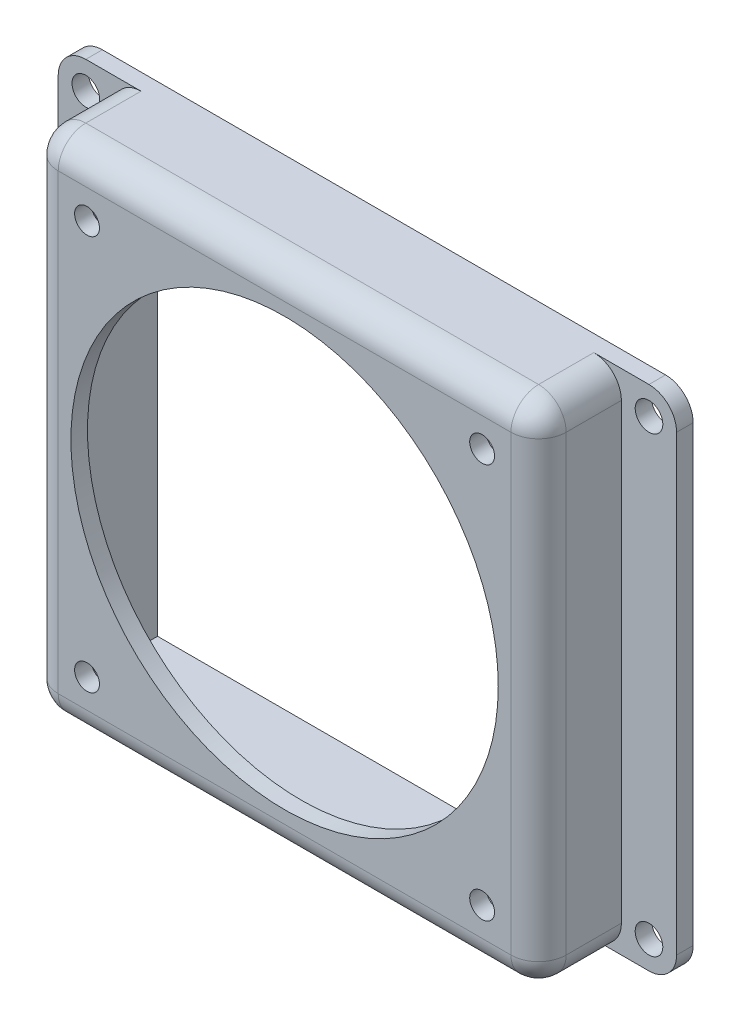
ISO-10303-21;
HEADER;
FILE_DESCRIPTION(('STEP AP214'),'2;1');
FILE_NAME('part.step','',(''),(''),'','','');
FILE_SCHEMA(('AUTOMOTIVE_DESIGN { 1 0 10303 214 1 1 1 1 }'));
ENDSEC;
DATA;
#1=APPLICATION_CONTEXT('core data for automotive mechanical design processes');
#2=APPLICATION_PROTOCOL_DEFINITION('international standard','automotive_design',2000,#1);
#3=PRODUCT_CONTEXT('',#1,'mechanical');
#4=PRODUCT('Part','Part','',(#3));
#5=PRODUCT_RELATED_PRODUCT_CATEGORY('part','',(#4));
#6=PRODUCT_DEFINITION_FORMATION('','',#4);
#7=PRODUCT_DEFINITION_CONTEXT('part definition',#1,'design');
#8=PRODUCT_DEFINITION('design','',#6,#7);
#9=PRODUCT_DEFINITION_SHAPE('','',#8);
#10=(LENGTH_UNIT() NAMED_UNIT(*) SI_UNIT(.MILLI.,.METRE.));
#11=(NAMED_UNIT(*) PLANE_ANGLE_UNIT() SI_UNIT($,.RADIAN.));
#12=(NAMED_UNIT(*) SI_UNIT($,.STERADIAN.) SOLID_ANGLE_UNIT());
#13=UNCERTAINTY_MEASURE_WITH_UNIT(LENGTH_MEASURE(1.E-05),#10,'distance_accuracy_value','');
#14=(GEOMETRIC_REPRESENTATION_CONTEXT(3) GLOBAL_UNCERTAINTY_ASSIGNED_CONTEXT((#13)) GLOBAL_UNIT_ASSIGNED_CONTEXT((#10,
#11,#12)) REPRESENTATION_CONTEXT('',''));
#15=CARTESIAN_POINT('',(0.,0.,0.));
#16=DIRECTION('',(0.,0.,1.));
#17=DIRECTION('',(1.,0.,0.));
#18=AXIS2_PLACEMENT_3D('',#15,#16,#17);
#19=CARTESIAN_POINT('',(0.,0.,3.));
#20=DIRECTION('',(0.,0.,-1.));
#21=DIRECTION('',(-1.,0.,0.));
#22=AXIS2_PLACEMENT_3D('',#19,#20,#21);
#23=PLANE('',#22);
#24=DIRECTION('',(-1.,0.,0.));
#25=VECTOR('',#24,1.);
#26=CARTESIAN_POINT('',(0.,41.,3.));
#27=LINE('',#26,#25);
#28=CARTESIAN_POINT('',(41.,41.,3.));
#29=VERTEX_POINT('',#28);
#30=CARTESIAN_POINT('',(-41.,41.,3.));
#31=VERTEX_POINT('',#30);
#32=EDGE_CURVE('E373',#29,#31,#27,.T.);
#33=ORIENTED_EDGE('',*,*,#32,.T.);
#34=DIRECTION('',(0.,-1.,0.));
#35=VECTOR('',#34,1.);
#36=CARTESIAN_POINT('',(-41.,0.,3.));
#37=LINE('',#36,#35);
#38=CARTESIAN_POINT('',(-41.,-41.,3.));
#39=VERTEX_POINT('',#38);
#40=EDGE_CURVE('E376',#31,#39,#37,.T.);
#41=ORIENTED_EDGE('',*,*,#40,.T.);
#42=DIRECTION('',(1.,0.,0.));
#43=VECTOR('',#42,1.);
#44=CARTESIAN_POINT('',(0.,-41.,3.));
#45=LINE('',#44,#43);
#46=CARTESIAN_POINT('',(41.,-41.,3.));
#47=VERTEX_POINT('',#46);
#48=EDGE_CURVE('E367',#39,#47,#45,.T.);
#49=ORIENTED_EDGE('',*,*,#48,.T.);
#50=DIRECTION('',(0.,1.,0.));
#51=VECTOR('',#50,1.);
#52=CARTESIAN_POINT('',(41.,0.,3.));
#53=LINE('',#52,#51);
#54=EDGE_CURVE('E370',#47,#29,#53,.T.);
#55=ORIENTED_EDGE('',*,*,#54,.T.);
#56=EDGE_LOOP('',(#33,#41,#49,#55));
#57=FACE_BOUND('',#56,.T.);
#58=CARTESIAN_POINT('',(0.,0.,3.));
#59=DIRECTION('',(0.,0.,1.));
#60=DIRECTION('',(1.,0.,0.));
#61=AXIS2_PLACEMENT_3D('',#58,#59,#60);
#62=CIRCLE('',#61,38.7);
#63=CARTESIAN_POINT('',(38.7,0.,3.));
#64=VERTEX_POINT('',#63);
#65=EDGE_CURVE('E288',#64,#64,#62,.T.);
#66=ORIENTED_EDGE('',*,*,#65,.F.);
#67=EDGE_LOOP('',(#66));
#68=FACE_BOUND('',#67,.T.);
#69=CARTESIAN_POINT('',(-35.78,35.78,3.));
#70=DIRECTION('',(0.,0.,1.));
#71=DIRECTION('',(1.,0.,0.));
#72=AXIS2_PLACEMENT_3D('',#69,#70,#71);
#73=CIRCLE('',#72,2.25);
#74=CARTESIAN_POINT('',(-33.53,35.78,3.));
#75=VERTEX_POINT('',#74);
#76=EDGE_CURVE('E280',#75,#75,#73,.T.);
#77=ORIENTED_EDGE('',*,*,#76,.F.);
#78=EDGE_LOOP('',(#77));
#79=FACE_BOUND('',#78,.T.);
#80=CARTESIAN_POINT('',(35.78,35.78,3.));
#81=DIRECTION('',(0.,0.,1.));
#82=DIRECTION('',(1.,0.,0.));
#83=AXIS2_PLACEMENT_3D('',#80,#81,#82);
#84=CIRCLE('',#83,2.25);
#85=CARTESIAN_POINT('',(38.03,35.78,3.));
#86=VERTEX_POINT('',#85);
#87=EDGE_CURVE('E272',#86,#86,#84,.T.);
#88=ORIENTED_EDGE('',*,*,#87,.F.);
#89=EDGE_LOOP('',(#88));
#90=FACE_BOUND('',#89,.T.);
#91=CARTESIAN_POINT('',(35.78,-35.78,3.));
#92=DIRECTION('',(0.,0.,1.));
#93=DIRECTION('',(1.,0.,0.));
#94=AXIS2_PLACEMENT_3D('',#91,#92,#93);
#95=CIRCLE('',#94,2.25);
#96=CARTESIAN_POINT('',(38.03,-35.78,3.));
#97=VERTEX_POINT('',#96);
#98=EDGE_CURVE('E264',#97,#97,#95,.T.);
#99=ORIENTED_EDGE('',*,*,#98,.F.);
#100=EDGE_LOOP('',(#99));
#101=FACE_BOUND('',#100,.T.);
#102=CARTESIAN_POINT('',(-35.78,-35.78,3.));
#103=DIRECTION('',(0.,0.,1.));
#104=DIRECTION('',(1.,0.,0.));
#105=AXIS2_PLACEMENT_3D('',#102,#103,#104);
#106=CIRCLE('',#105,2.25);
#107=CARTESIAN_POINT('',(-33.53,-35.78,3.));
#108=VERTEX_POINT('',#107);
#109=EDGE_CURVE('E256',#108,#108,#106,.T.);
#110=ORIENTED_EDGE('',*,*,#109,.F.);
#111=EDGE_LOOP('',(#110));
#112=FACE_BOUND('',#111,.T.);
#113=ADVANCED_FACE('F39',(#57,#68,#79,#90,#101,#112),#23,.F.);
#114=CARTESIAN_POINT('',(0.,0.,0.));
#115=DIRECTION('',(0.,0.,-1.));
#116=DIRECTION('',(-1.,0.,0.));
#117=AXIS2_PLACEMENT_3D('',#114,#115,#116);
#118=PLANE('',#117);
#119=DIRECTION('',(0.,1.,0.));
#120=VECTOR('',#119,1.);
#121=CARTESIAN_POINT('',(-41.,-41.,0.));
#122=LINE('',#121,#120);
#123=CARTESIAN_POINT('',(-41.,-41.,0.));
#124=VERTEX_POINT('',#123);
#125=CARTESIAN_POINT('',(-41.,41.,0.));
#126=VERTEX_POINT('',#125);
#127=EDGE_CURVE('E229',#124,#126,#122,.T.);
#128=ORIENTED_EDGE('',*,*,#127,.T.);
#129=DIRECTION('',(1.,0.,0.));
#130=VECTOR('',#129,1.);
#131=CARTESIAN_POINT('',(-41.,41.,0.));
#132=LINE('',#131,#130);
#133=CARTESIAN_POINT('',(41.,41.,0.));
#134=VERTEX_POINT('',#133);
#135=EDGE_CURVE('E210',#126,#134,#132,.T.);
#136=ORIENTED_EDGE('',*,*,#135,.T.);
#137=DIRECTION('',(0.,-1.,0.));
#138=VECTOR('',#137,1.);
#139=CARTESIAN_POINT('',(41.,-41.,0.));
#140=LINE('',#139,#138);
#141=CARTESIAN_POINT('',(41.,-41.,0.));
#142=VERTEX_POINT('',#141);
#143=EDGE_CURVE('E235',#134,#142,#140,.T.);
#144=ORIENTED_EDGE('',*,*,#143,.T.);
#145=DIRECTION('',(-1.,0.,0.));
#146=VECTOR('',#145,1.);
#147=CARTESIAN_POINT('',(-41.,-41.,0.));
#148=LINE('',#147,#146);
#149=EDGE_CURVE('E203',#142,#124,#148,.T.);
#150=ORIENTED_EDGE('',*,*,#149,.T.);
#151=EDGE_LOOP('',(#128,#136,#144,#150));
#152=FACE_BOUND('',#151,.T.);
#153=CARTESIAN_POINT('',(35.78,-35.78,0.));
#154=DIRECTION('',(0.,0.,1.));
#155=DIRECTION('',(1.,0.,0.));
#156=AXIS2_PLACEMENT_3D('',#153,#154,#155);
#157=CIRCLE('',#156,2.25);
#158=CARTESIAN_POINT('',(38.03,-35.78,0.));
#159=VERTEX_POINT('',#158);
#160=EDGE_CURVE('E260',#159,#159,#157,.T.);
#161=ORIENTED_EDGE('',*,*,#160,.T.);
#162=EDGE_LOOP('',(#161));
#163=FACE_BOUND('',#162,.T.);
#164=CARTESIAN_POINT('',(-35.78,35.78,0.));
#165=DIRECTION('',(0.,0.,1.));
#166=DIRECTION('',(1.,0.,0.));
#167=AXIS2_PLACEMENT_3D('',#164,#165,#166);
#168=CIRCLE('',#167,2.25);
#169=CARTESIAN_POINT('',(-33.53,35.78,0.));
#170=VERTEX_POINT('',#169);
#171=EDGE_CURVE('E276',#170,#170,#168,.T.);
#172=ORIENTED_EDGE('',*,*,#171,.T.);
#173=EDGE_LOOP('',(#172));
#174=FACE_BOUND('',#173,.T.);
#175=CARTESIAN_POINT('',(0.,0.,0.));
#176=DIRECTION('',(0.,0.,1.));
#177=DIRECTION('',(1.,0.,0.));
#178=AXIS2_PLACEMENT_3D('',#175,#176,#177);
#179=CIRCLE('',#178,38.7);
#180=CARTESIAN_POINT('',(38.7,0.,0.));
#181=VERTEX_POINT('',#180);
#182=EDGE_CURVE('E284',#181,#181,#179,.T.);
#183=ORIENTED_EDGE('',*,*,#182,.T.);
#184=EDGE_LOOP('',(#183));
#185=FACE_BOUND('',#184,.T.);
#186=CARTESIAN_POINT('',(35.78,35.78,0.));
#187=DIRECTION('',(0.,0.,1.));
#188=DIRECTION('',(1.,0.,0.));
#189=AXIS2_PLACEMENT_3D('',#186,#187,#188);
#190=CIRCLE('',#189,2.25);
#191=CARTESIAN_POINT('',(38.03,35.78,0.));
#192=VERTEX_POINT('',#191);
#193=EDGE_CURVE('E268',#192,#192,#190,.T.);
#194=ORIENTED_EDGE('',*,*,#193,.T.);
#195=EDGE_LOOP('',(#194));
#196=FACE_BOUND('',#195,.T.);
#197=CARTESIAN_POINT('',(-35.78,-35.78,0.));
#198=DIRECTION('',(0.,0.,1.));
#199=DIRECTION('',(1.,0.,0.));
#200=AXIS2_PLACEMENT_3D('',#197,#198,#199);
#201=CIRCLE('',#200,2.25);
#202=CARTESIAN_POINT('',(-33.53,-35.78,0.));
#203=VERTEX_POINT('',#202);
#204=EDGE_CURVE('E255',#203,#203,#201,.T.);
#205=ORIENTED_EDGE('',*,*,#204,.T.);
#206=EDGE_LOOP('',(#205));
#207=FACE_BOUND('',#206,.T.);
#208=ADVANCED_FACE('F610',(#152,#163,#174,#185,#196,#207),#118,.T.);
#209=CARTESIAN_POINT('',(-46.,-46.,3.));
#210=DIRECTION('',(1.,0.,0.));
#211=DIRECTION('',(0.,0.,-1.));
#212=AXIS2_PLACEMENT_3D('',#209,#210,#211);
#213=PLANE('',#212);
#214=DIRECTION('',(0.,-1.,0.));
#215=VECTOR('',#214,1.);
#216=CARTESIAN_POINT('',(-46.,46.,-12.));
#217=LINE('',#216,#215);
#218=CARTESIAN_POINT('',(-46.,41.,-12.));
#219=VERTEX_POINT('',#218);
#220=CARTESIAN_POINT('',(-46.,-41.,-12.));
#221=VERTEX_POINT('',#220);
#222=EDGE_CURVE('E472',#219,#221,#217,.T.);
#223=ORIENTED_EDGE('',*,*,#222,.T.);
#224=DIRECTION('',(0.,0.,-1.));
#225=VECTOR('',#224,1.);
#226=CARTESIAN_POINT('',(-46.,-41.,3.));
#227=LINE('',#226,#225);
#228=CARTESIAN_POINT('',(-46.,-41.,-2.));
#229=VERTEX_POINT('',#228);
#230=EDGE_CURVE('E387',#221,#229,#227,.F.);
#231=ORIENTED_EDGE('',*,*,#230,.T.);
#232=DIRECTION('',(0.,-1.,0.));
#233=VECTOR('',#232,1.);
#234=CARTESIAN_POINT('',(-46.,-46.,-2.));
#235=LINE('',#234,#233);
#236=CARTESIAN_POINT('',(-46.,41.,-2.));
#237=VERTEX_POINT('',#236);
#238=EDGE_CURVE('E383',#229,#237,#235,.F.);
#239=ORIENTED_EDGE('',*,*,#238,.T.);
#240=DIRECTION('',(0.,0.,-1.));
#241=VECTOR('',#240,1.);
#242=CARTESIAN_POINT('',(-46.,41.,3.));
#243=LINE('',#242,#241);
#244=EDGE_CURVE('E380',#237,#219,#243,.T.);
#245=ORIENTED_EDGE('',*,*,#244,.T.);
#246=EDGE_LOOP('',(#223,#231,#239,#245));
#247=FACE_BOUND('',#246,.T.);
#248=ADVANCED_FACE('F576',(#247),#213,.F.);
#249=CARTESIAN_POINT('',(-46.,-46.,3.));
#250=DIRECTION('',(0.,1.,0.));
#251=DIRECTION('',(0.,0.,1.));
#252=AXIS2_PLACEMENT_3D('',#249,#250,#251);
#253=PLANE('',#252);
#254=DIRECTION('',(-1.,0.,0.));
#255=VECTOR('',#254,1.);
#256=CARTESIAN_POINT('',(-46.,-46.,-12.));
#257=LINE('',#256,#255);
#258=CARTESIAN_POINT('',(-41.,-46.,-12.));
#259=VERTEX_POINT('',#258);
#260=CARTESIAN_POINT('',(-51.,-46.,-12.));
#261=VERTEX_POINT('',#260);
#262=EDGE_CURVE('E476',#259,#261,#257,.T.);
#263=ORIENTED_EDGE('',*,*,#262,.T.);
#264=DIRECTION('',(0.,0.,-1.));
#265=VECTOR('',#264,1.);
#266=CARTESIAN_POINT('',(-51.,-46.,-15.));
#267=LINE('',#266,#265);
#268=CARTESIAN_POINT('',(-51.,-46.,-15.));
#269=VERTEX_POINT('',#268);
#270=EDGE_CURVE('E350',#261,#269,#267,.T.);
#271=ORIENTED_EDGE('',*,*,#270,.T.);
#272=DIRECTION('',(-1.,0.,0.));
#273=VECTOR('',#272,1.);
#274=CARTESIAN_POINT('',(46.,-46.,-15.));
#275=LINE('',#274,#273);
#276=CARTESIAN_POINT('',(51.,-46.,-15.));
#277=VERTEX_POINT('',#276);
#278=EDGE_CURVE('E212',#277,#269,#275,.T.);
#279=ORIENTED_EDGE('',*,*,#278,.F.);
#280=DIRECTION('',(0.,0.,-1.));
#281=VECTOR('',#280,1.);
#282=CARTESIAN_POINT('',(51.,-46.,-12.));
#283=LINE('',#282,#281);
#284=CARTESIAN_POINT('',(51.,-46.,-12.));
#285=VERTEX_POINT('',#284);
#286=EDGE_CURVE('E347',#277,#285,#283,.F.);
#287=ORIENTED_EDGE('',*,*,#286,.T.);
#288=DIRECTION('',(-1.,0.,0.));
#289=VECTOR('',#288,1.);
#290=CARTESIAN_POINT('',(46.,-46.,-12.));
#291=LINE('',#290,#289);
#292=CARTESIAN_POINT('',(41.,-46.,-12.));
#293=VERTEX_POINT('',#292);
#294=EDGE_CURVE('E232',#285,#293,#291,.T.);
#295=ORIENTED_EDGE('',*,*,#294,.T.);
#296=DIRECTION('',(0.,0.,-1.));
#297=VECTOR('',#296,1.);
#298=CARTESIAN_POINT('',(41.,-46.,3.));
#299=LINE('',#298,#297);
#300=CARTESIAN_POINT('',(41.,-46.,-2.));
#301=VERTEX_POINT('',#300);
#302=EDGE_CURVE('E337',#293,#301,#299,.F.);
#303=ORIENTED_EDGE('',*,*,#302,.T.);
#304=DIRECTION('',(1.,0.,0.));
#305=VECTOR('',#304,1.);
#306=CARTESIAN_POINT('',(-46.,-46.,-2.));
#307=LINE('',#306,#305);
#308=CARTESIAN_POINT('',(-41.,-46.,-2.));
#309=VERTEX_POINT('',#308);
#310=EDGE_CURVE('E340',#301,#309,#307,.F.);
#311=ORIENTED_EDGE('',*,*,#310,.T.);
#312=DIRECTION('',(0.,0.,-1.));
#313=VECTOR('',#312,1.);
#314=CARTESIAN_POINT('',(-41.,-46.,3.));
#315=LINE('',#314,#313);
#316=EDGE_CURVE('E343',#309,#259,#315,.T.);
#317=ORIENTED_EDGE('',*,*,#316,.T.);
#318=EDGE_LOOP('',(#263,#271,#279,#287,#295,#303,#311,#317));
#319=FACE_BOUND('',#318,.T.);
#320=ADVANCED_FACE('F563',(#319),#253,.F.);
#321=CARTESIAN_POINT('',(46.,-46.,3.));
#322=DIRECTION('',(-1.,0.,0.));
#323=DIRECTION('',(0.,-1.,0.));
#324=AXIS2_PLACEMENT_3D('',#321,#322,#323);
#325=PLANE('',#324);
#326=DIRECTION('',(0.,1.,0.));
#327=VECTOR('',#326,1.);
#328=CARTESIAN_POINT('',(46.,46.,-12.));
#329=LINE('',#328,#327);
#330=CARTESIAN_POINT('',(46.,-41.,-12.));
#331=VERTEX_POINT('',#330);
#332=CARTESIAN_POINT('',(46.,41.,-12.));
#333=VERTEX_POINT('',#332);
#334=EDGE_CURVE('E507',#331,#333,#329,.T.);
#335=ORIENTED_EDGE('',*,*,#334,.T.);
#336=DIRECTION('',(0.,0.,-1.));
#337=VECTOR('',#336,1.);
#338=CARTESIAN_POINT('',(46.,41.,3.));
#339=LINE('',#338,#337);
#340=CARTESIAN_POINT('',(46.,41.,-2.));
#341=VERTEX_POINT('',#340);
#342=EDGE_CURVE('E57',#333,#341,#339,.F.);
#343=ORIENTED_EDGE('',*,*,#342,.T.);
#344=DIRECTION('',(0.,1.,0.));
#345=VECTOR('',#344,1.);
#346=CARTESIAN_POINT('',(46.,-46.,-2.));
#347=LINE('',#346,#345);
#348=CARTESIAN_POINT('',(46.,-41.,-2.));
#349=VERTEX_POINT('',#348);
#350=EDGE_CURVE('E61',#341,#349,#347,.F.);
#351=ORIENTED_EDGE('',*,*,#350,.T.);
#352=DIRECTION('',(0.,0.,-1.));
#353=VECTOR('',#352,1.);
#354=CARTESIAN_POINT('',(46.,-41.,3.));
#355=LINE('',#354,#353);
#356=EDGE_CURVE('E390',#349,#331,#355,.T.);
#357=ORIENTED_EDGE('',*,*,#356,.T.);
#358=EDGE_LOOP('',(#335,#343,#351,#357));
#359=FACE_BOUND('',#358,.T.);
#360=ADVANCED_FACE('F544',(#359),#325,.F.);
#361=CARTESIAN_POINT('',(-46.,46.,3.));
#362=DIRECTION('',(0.,-1.,0.));
#363=DIRECTION('',(1.,0.,0.));
#364=AXIS2_PLACEMENT_3D('',#361,#362,#363);
#365=PLANE('',#364);
#366=DIRECTION('',(1.,0.,0.));
#367=VECTOR('',#366,1.);
#368=CARTESIAN_POINT('',(-46.,46.,-15.));
#369=LINE('',#368,#367);
#370=CARTESIAN_POINT('',(-51.,46.,-15.));
#371=VERTEX_POINT('',#370);
#372=CARTESIAN_POINT('',(51.,46.,-15.));
#373=VERTEX_POINT('',#372);
#374=EDGE_CURVE('E251',#371,#373,#369,.T.);
#375=ORIENTED_EDGE('',*,*,#374,.F.);
#376=DIRECTION('',(0.,0.,-1.));
#377=VECTOR('',#376,1.);
#378=CARTESIAN_POINT('',(-51.,46.,-12.));
#379=LINE('',#378,#377);
#380=CARTESIAN_POINT('',(-51.,46.,-12.));
#381=VERTEX_POINT('',#380);
#382=EDGE_CURVE('E328',#371,#381,#379,.F.);
#383=ORIENTED_EDGE('',*,*,#382,.T.);
#384=DIRECTION('',(1.,0.,0.));
#385=VECTOR('',#384,1.);
#386=CARTESIAN_POINT('',(-46.,46.,-12.));
#387=LINE('',#386,#385);
#388=CARTESIAN_POINT('',(-41.,46.,-12.));
#389=VERTEX_POINT('',#388);
#390=EDGE_CURVE('E484',#381,#389,#387,.T.);
#391=ORIENTED_EDGE('',*,*,#390,.T.);
#392=DIRECTION('',(0.,0.,-1.));
#393=VECTOR('',#392,1.);
#394=CARTESIAN_POINT('',(-41.,46.,3.));
#395=LINE('',#394,#393);
#396=CARTESIAN_POINT('',(-41.,46.,-2.));
#397=VERTEX_POINT('',#396);
#398=EDGE_CURVE('E321',#389,#397,#395,.F.);
#399=ORIENTED_EDGE('',*,*,#398,.T.);
#400=DIRECTION('',(-1.,0.,0.));
#401=VECTOR('',#400,1.);
#402=CARTESIAN_POINT('',(-46.,46.,-2.));
#403=LINE('',#402,#401);
#404=CARTESIAN_POINT('',(41.,46.,-2.));
#405=VERTEX_POINT('',#404);
#406=EDGE_CURVE('E318',#397,#405,#403,.F.);
#407=ORIENTED_EDGE('',*,*,#406,.T.);
#408=DIRECTION('',(0.,0.,-1.));
#409=VECTOR('',#408,1.);
#410=CARTESIAN_POINT('',(41.,46.,3.));
#411=LINE('',#410,#409);
#412=CARTESIAN_POINT('',(41.,46.,-12.));
#413=VERTEX_POINT('',#412);
#414=EDGE_CURVE('E314',#405,#413,#411,.T.);
#415=ORIENTED_EDGE('',*,*,#414,.T.);
#416=DIRECTION('',(1.,0.,0.));
#417=VECTOR('',#416,1.);
#418=CARTESIAN_POINT('',(46.,46.,-12.));
#419=LINE('',#418,#417);
#420=CARTESIAN_POINT('',(51.,46.,-12.));
#421=VERTEX_POINT('',#420);
#422=EDGE_CURVE('E510',#413,#421,#419,.T.);
#423=ORIENTED_EDGE('',*,*,#422,.T.);
#424=DIRECTION('',(0.,0.,-1.));
#425=VECTOR('',#424,1.);
#426=CARTESIAN_POINT('',(51.,46.,-15.));
#427=LINE('',#426,#425);
#428=EDGE_CURVE('E324',#421,#373,#427,.T.);
#429=ORIENTED_EDGE('',*,*,#428,.T.);
#430=EDGE_LOOP('',(#375,#383,#391,#399,#407,#415,#423,#429));
#431=FACE_BOUND('',#430,.T.);
#432=ADVANCED_FACE('F537',(#431),#365,.F.);
#433=CARTESIAN_POINT('',(0.,0.,3.));
#434=DIRECTION('',(0.,0.,-1.));
#435=DIRECTION('',(-1.,0.,0.));
#436=AXIS2_PLACEMENT_3D('',#433,#434,#435);
#437=CYLINDRICAL_SURFACE('',#436,38.7);
#438=ORIENTED_EDGE('',*,*,#65,.T.);
#439=EDGE_LOOP('',(#438));
#440=FACE_BOUND('',#439,.T.);
#441=ORIENTED_EDGE('',*,*,#182,.F.);
#442=EDGE_LOOP('',(#441));
#443=FACE_BOUND('',#442,.T.);
#444=ADVANCED_FACE('F620',(#440,#443),#437,.F.);
#445=CARTESIAN_POINT('',(-35.78,35.78,3.));
#446=DIRECTION('',(0.,0.,-1.));
#447=DIRECTION('',(-1.,0.,0.));
#448=AXIS2_PLACEMENT_3D('',#445,#446,#447);
#449=CYLINDRICAL_SURFACE('',#448,2.25);
#450=ORIENTED_EDGE('',*,*,#76,.T.);
#451=EDGE_LOOP('',(#450));
#452=FACE_BOUND('',#451,.T.);
#453=ORIENTED_EDGE('',*,*,#171,.F.);
#454=EDGE_LOOP('',(#453));
#455=FACE_BOUND('',#454,.T.);
#456=ADVANCED_FACE('F907',(#452,#455),#449,.F.);
#457=CARTESIAN_POINT('',(35.78,35.78,3.));
#458=DIRECTION('',(0.,0.,-1.));
#459=DIRECTION('',(-1.,0.,0.));
#460=AXIS2_PLACEMENT_3D('',#457,#458,#459);
#461=CYLINDRICAL_SURFACE('',#460,2.25);
#462=ORIENTED_EDGE('',*,*,#87,.T.);
#463=EDGE_LOOP('',(#462));
#464=FACE_BOUND('',#463,.T.);
#465=ORIENTED_EDGE('',*,*,#193,.F.);
#466=EDGE_LOOP('',(#465));
#467=FACE_BOUND('',#466,.T.);
#468=ADVANCED_FACE('F915',(#464,#467),#461,.F.);
#469=CARTESIAN_POINT('',(35.78,-35.78,3.));
#470=DIRECTION('',(0.,0.,-1.));
#471=DIRECTION('',(-1.,0.,0.));
#472=AXIS2_PLACEMENT_3D('',#469,#470,#471);
#473=CYLINDRICAL_SURFACE('',#472,2.25);
#474=ORIENTED_EDGE('',*,*,#98,.T.);
#475=EDGE_LOOP('',(#474));
#476=FACE_BOUND('',#475,.T.);
#477=ORIENTED_EDGE('',*,*,#160,.F.);
#478=EDGE_LOOP('',(#477));
#479=FACE_BOUND('',#478,.T.);
#480=ADVANCED_FACE('F923',(#476,#479),#473,.F.);
#481=CARTESIAN_POINT('',(-35.78,-35.78,3.));
#482=DIRECTION('',(0.,0.,-1.));
#483=DIRECTION('',(-1.,0.,0.));
#484=AXIS2_PLACEMENT_3D('',#481,#482,#483);
#485=CYLINDRICAL_SURFACE('',#484,2.25);
#486=ORIENTED_EDGE('',*,*,#109,.T.);
#487=EDGE_LOOP('',(#486));
#488=FACE_BOUND('',#487,.T.);
#489=ORIENTED_EDGE('',*,*,#204,.F.);
#490=EDGE_LOOP('',(#489));
#491=FACE_BOUND('',#490,.T.);
#492=ADVANCED_FACE('F836',(#488,#491),#485,.F.);
#493=CARTESIAN_POINT('',(0.,0.,-15.));
#494=DIRECTION('',(0.,0.,-1.));
#495=DIRECTION('',(-1.,0.,0.));
#496=AXIS2_PLACEMENT_3D('',#493,#494,#495);
#497=PLANE('',#496);
#498=DIRECTION('',(0.,1.,0.));
#499=VECTOR('',#498,1.);
#500=CARTESIAN_POINT('',(-56.,46.,-15.));
#501=LINE('',#500,#499);
#502=CARTESIAN_POINT('',(-56.,-41.,-15.));
#503=VERTEX_POINT('',#502);
#504=CARTESIAN_POINT('',(-56.,41.,-15.));
#505=VERTEX_POINT('',#504);
#506=EDGE_CURVE('E468',#503,#505,#501,.T.);
#507=ORIENTED_EDGE('',*,*,#506,.T.);
#508=CARTESIAN_POINT('',(-51.,41.,-15.));
#509=DIRECTION('',(0.,0.,-1.));
#510=DIRECTION('',(-1.,0.,0.));
#511=AXIS2_PLACEMENT_3D('',#508,#509,#510);
#512=CIRCLE('',#511,5.);
#513=EDGE_CURVE('E311',#505,#371,#512,.T.);
#514=ORIENTED_EDGE('',*,*,#513,.T.);
#515=ORIENTED_EDGE('',*,*,#374,.T.);
#516=CARTESIAN_POINT('',(51.,41.,-15.));
#517=DIRECTION('',(0.,0.,-1.));
#518=DIRECTION('',(-1.,0.,0.));
#519=AXIS2_PLACEMENT_3D('',#516,#517,#518);
#520=CIRCLE('',#519,5.);
#521=CARTESIAN_POINT('',(56.,41.,-15.));
#522=VERTEX_POINT('',#521);
#523=EDGE_CURVE('E305',#373,#522,#520,.T.);
#524=ORIENTED_EDGE('',*,*,#523,.T.);
#525=DIRECTION('',(0.,-1.,0.));
#526=VECTOR('',#525,1.);
#527=CARTESIAN_POINT('',(56.,46.,-15.));
#528=LINE('',#527,#526);
#529=CARTESIAN_POINT('',(56.,-41.,-15.));
#530=VERTEX_POINT('',#529);
#531=EDGE_CURVE('E503',#522,#530,#528,.T.);
#532=ORIENTED_EDGE('',*,*,#531,.T.);
#533=CARTESIAN_POINT('',(51.,-41.,-15.));
#534=DIRECTION('',(0.,0.,-1.));
#535=DIRECTION('',(-1.,0.,0.));
#536=AXIS2_PLACEMENT_3D('',#533,#534,#535);
#537=CIRCLE('',#536,5.);
#538=EDGE_CURVE('E302',#530,#277,#537,.T.);
#539=ORIENTED_EDGE('',*,*,#538,.T.);
#540=ORIENTED_EDGE('',*,*,#278,.T.);
#541=CARTESIAN_POINT('',(-51.,-41.,-15.));
#542=DIRECTION('',(0.,0.,-1.));
#543=DIRECTION('',(-1.,0.,0.));
#544=AXIS2_PLACEMENT_3D('',#541,#542,#543);
#545=CIRCLE('',#544,5.);
#546=EDGE_CURVE('E308',#269,#503,#545,.T.);
#547=ORIENTED_EDGE('',*,*,#546,.T.);
#548=EDGE_LOOP('',(#507,#514,#515,#524,#532,#539,#540,#547));
#549=FACE_BOUND('',#548,.T.);
#550=DIRECTION('',(1.,0.,0.));
#551=VECTOR('',#550,1.);
#552=CARTESIAN_POINT('',(-41.,41.,-15.));
#553=LINE('',#552,#551);
#554=CARTESIAN_POINT('',(-41.,41.,-15.));
#555=VERTEX_POINT('',#554);
#556=CARTESIAN_POINT('',(41.,41.,-15.));
#557=VERTEX_POINT('',#556);
#558=EDGE_CURVE('E202',#555,#557,#553,.T.);
#559=ORIENTED_EDGE('',*,*,#558,.F.);
#560=DIRECTION('',(0.,1.,0.));
#561=VECTOR('',#560,1.);
#562=CARTESIAN_POINT('',(-41.,-41.,-15.));
#563=LINE('',#562,#561);
#564=CARTESIAN_POINT('',(-41.,-41.,-15.));
#565=VERTEX_POINT('',#564);
#566=EDGE_CURVE('E191',#565,#555,#563,.T.);
#567=ORIENTED_EDGE('',*,*,#566,.F.);
#568=DIRECTION('',(-1.,0.,0.));
#569=VECTOR('',#568,1.);
#570=CARTESIAN_POINT('',(-41.,-41.,-15.));
#571=LINE('',#570,#569);
#572=CARTESIAN_POINT('',(41.,-41.,-15.));
#573=VERTEX_POINT('',#572);
#574=EDGE_CURVE('E223',#573,#565,#571,.T.);
#575=ORIENTED_EDGE('',*,*,#574,.F.);
#576=DIRECTION('',(0.,-1.,0.));
#577=VECTOR('',#576,1.);
#578=CARTESIAN_POINT('',(41.,-41.,-15.));
#579=LINE('',#578,#577);
#580=EDGE_CURVE('E219',#557,#573,#579,.T.);
#581=ORIENTED_EDGE('',*,*,#580,.F.);
#582=EDGE_LOOP('',(#559,#567,#575,#581));
#583=FACE_BOUND('',#582,.T.);
#584=CARTESIAN_POINT('',(51.,-41.,-15.));
#585=DIRECTION('',(0.,0.,-1.));
#586=DIRECTION('',(-1.,0.,0.));
#587=AXIS2_PLACEMENT_3D('',#584,#585,#586);
#588=CIRCLE('',#587,2.5);
#589=CARTESIAN_POINT('',(48.5,-41.,-15.));
#590=VERTEX_POINT('',#589);
#591=EDGE_CURVE('E487',#590,#590,#588,.T.);
#592=ORIENTED_EDGE('',*,*,#591,.F.);
#593=EDGE_LOOP('',(#592));
#594=FACE_BOUND('',#593,.T.);
#595=CARTESIAN_POINT('',(51.,41.,-15.));
#596=DIRECTION('',(0.,0.,-1.));
#597=DIRECTION('',(-1.,0.,0.));
#598=AXIS2_PLACEMENT_3D('',#595,#596,#597);
#599=CIRCLE('',#598,2.5);
#600=CARTESIAN_POINT('',(48.5,41.,-15.));
#601=VERTEX_POINT('',#600);
#602=EDGE_CURVE('E495',#601,#601,#599,.T.);
#603=ORIENTED_EDGE('',*,*,#602,.F.);
#604=EDGE_LOOP('',(#603));
#605=FACE_BOUND('',#604,.T.);
#606=CARTESIAN_POINT('',(-51.,-41.,-15.));
#607=DIRECTION('',(0.,0.,-1.));
#608=DIRECTION('',(-1.,0.,0.));
#609=AXIS2_PLACEMENT_3D('',#606,#607,#608);
#610=CIRCLE('',#609,2.5);
#611=CARTESIAN_POINT('',(-53.5,-41.,-15.));
#612=VERTEX_POINT('',#611);
#613=EDGE_CURVE('E451',#612,#612,#610,.T.);
#614=ORIENTED_EDGE('',*,*,#613,.F.);
#615=EDGE_LOOP('',(#614));
#616=FACE_BOUND('',#615,.T.);
#617=CARTESIAN_POINT('',(-51.,41.,-15.));
#618=DIRECTION('',(0.,0.,-1.));
#619=DIRECTION('',(-1.,0.,0.));
#620=AXIS2_PLACEMENT_3D('',#617,#618,#619);
#621=CIRCLE('',#620,2.5);
#622=CARTESIAN_POINT('',(-53.5,41.,-15.));
#623=VERTEX_POINT('',#622);
#624=EDGE_CURVE('E461',#623,#623,#621,.T.);
#625=ORIENTED_EDGE('',*,*,#624,.F.);
#626=EDGE_LOOP('',(#625));
#627=FACE_BOUND('',#626,.T.);
#628=ADVANCED_FACE('F216',(#549,#583,#594,#605,#616,#627),#497,.T.);
#629=CARTESIAN_POINT('',(-41.,-41.,-15.));
#630=DIRECTION('',(1.,0.,0.));
#631=DIRECTION('',(0.,0.,-1.));
#632=AXIS2_PLACEMENT_3D('',#629,#630,#631);
#633=PLANE('',#632);
#634=ORIENTED_EDGE('',*,*,#127,.F.);
#635=DIRECTION('',(0.,0.,1.));
#636=VECTOR('',#635,1.);
#637=CARTESIAN_POINT('',(-41.,-41.,-15.));
#638=LINE('',#637,#636);
#639=EDGE_CURVE('E197',#565,#124,#638,.T.);
#640=ORIENTED_EDGE('',*,*,#639,.F.);
#641=ORIENTED_EDGE('',*,*,#566,.T.);
#642=DIRECTION('',(0.,0.,1.));
#643=VECTOR('',#642,1.);
#644=CARTESIAN_POINT('',(-41.,41.,-15.));
#645=LINE('',#644,#643);
#646=EDGE_CURVE('E195',#555,#126,#645,.T.);
#647=ORIENTED_EDGE('',*,*,#646,.T.);
#648=EDGE_LOOP('',(#634,#640,#641,#647));
#649=FACE_BOUND('',#648,.T.);
#650=ADVANCED_FACE('F194',(#649),#633,.T.);
#651=CARTESIAN_POINT('',(-41.,41.,-15.));
#652=DIRECTION('',(0.,-1.,0.));
#653=DIRECTION('',(0.,0.,-1.));
#654=AXIS2_PLACEMENT_3D('',#651,#652,#653);
#655=PLANE('',#654);
#656=ORIENTED_EDGE('',*,*,#135,.F.);
#657=ORIENTED_EDGE('',*,*,#646,.F.);
#658=ORIENTED_EDGE('',*,*,#558,.T.);
#659=DIRECTION('',(0.,0.,1.));
#660=VECTOR('',#659,1.);
#661=CARTESIAN_POINT('',(41.,41.,-15.));
#662=LINE('',#661,#660);
#663=EDGE_CURVE('E213',#557,#134,#662,.T.);
#664=ORIENTED_EDGE('',*,*,#663,.T.);
#665=EDGE_LOOP('',(#656,#657,#658,#664));
#666=FACE_BOUND('',#665,.T.);
#667=ADVANCED_FACE('F207',(#666),#655,.T.);
#668=CARTESIAN_POINT('',(41.,-41.,-15.));
#669=DIRECTION('',(-1.,0.,0.));
#670=DIRECTION('',(0.,0.,1.));
#671=AXIS2_PLACEMENT_3D('',#668,#669,#670);
#672=PLANE('',#671);
#673=ORIENTED_EDGE('',*,*,#143,.F.);
#674=ORIENTED_EDGE('',*,*,#663,.F.);
#675=ORIENTED_EDGE('',*,*,#580,.T.);
#676=DIRECTION('',(0.,0.,1.));
#677=VECTOR('',#676,1.);
#678=CARTESIAN_POINT('',(41.,-41.,-15.));
#679=LINE('',#678,#677);
#680=EDGE_CURVE('E242',#573,#142,#679,.T.);
#681=ORIENTED_EDGE('',*,*,#680,.T.);
#682=EDGE_LOOP('',(#673,#674,#675,#681));
#683=FACE_BOUND('',#682,.T.);
#684=ADVANCED_FACE('F949',(#683),#672,.T.);
#685=CARTESIAN_POINT('',(-41.,-41.,-15.));
#686=DIRECTION('',(0.,1.,0.));
#687=DIRECTION('',(0.,0.,1.));
#688=AXIS2_PLACEMENT_3D('',#685,#686,#687);
#689=PLANE('',#688);
#690=ORIENTED_EDGE('',*,*,#149,.F.);
#691=ORIENTED_EDGE('',*,*,#680,.F.);
#692=ORIENTED_EDGE('',*,*,#574,.T.);
#693=ORIENTED_EDGE('',*,*,#639,.T.);
#694=EDGE_LOOP('',(#690,#691,#692,#693));
#695=FACE_BOUND('',#694,.T.);
#696=ADVANCED_FACE('F828',(#695),#689,.T.);
#697=CARTESIAN_POINT('',(56.,46.,-12.));
#698=DIRECTION('',(1.,0.,0.));
#699=DIRECTION('',(0.,1.,0.));
#700=AXIS2_PLACEMENT_3D('',#697,#698,#699);
#701=PLANE('',#700);
#702=ORIENTED_EDGE('',*,*,#531,.F.);
#703=DIRECTION('',(0.,0.,-1.));
#704=VECTOR('',#703,1.);
#705=CARTESIAN_POINT('',(56.,41.,-12.));
#706=LINE('',#705,#704);
#707=CARTESIAN_POINT('',(56.,41.,-12.));
#708=VERTEX_POINT('',#707);
#709=EDGE_CURVE('E358',#522,#708,#706,.F.);
#710=ORIENTED_EDGE('',*,*,#709,.T.);
#711=DIRECTION('',(0.,-1.,0.));
#712=VECTOR('',#711,1.);
#713=CARTESIAN_POINT('',(56.,46.,-12.));
#714=LINE('',#713,#712);
#715=CARTESIAN_POINT('',(56.,-41.,-12.));
#716=VERTEX_POINT('',#715);
#717=EDGE_CURVE('E514',#708,#716,#714,.T.);
#718=ORIENTED_EDGE('',*,*,#717,.T.);
#719=DIRECTION('',(0.,0.,-1.));
#720=VECTOR('',#719,1.);
#721=CARTESIAN_POINT('',(56.,-41.,-15.));
#722=LINE('',#721,#720);
#723=EDGE_CURVE('E354',#716,#530,#722,.T.);
#724=ORIENTED_EDGE('',*,*,#723,.T.);
#725=EDGE_LOOP('',(#702,#710,#718,#724));
#726=FACE_BOUND('',#725,.T.);
#727=ADVANCED_FACE('F526',(#726),#701,.T.);
#728=CARTESIAN_POINT('',(0.,0.,-12.));
#729=DIRECTION('',(0.,0.,1.));
#730=DIRECTION('',(1.,0.,0.));
#731=AXIS2_PLACEMENT_3D('',#728,#729,#730);
#732=PLANE('',#731);
#733=CARTESIAN_POINT('',(51.,-41.,-12.));
#734=DIRECTION('',(0.,0.,-1.));
#735=DIRECTION('',(-1.,0.,0.));
#736=AXIS2_PLACEMENT_3D('',#733,#734,#735);
#737=CIRCLE('',#736,2.5);
#738=CARTESIAN_POINT('',(48.5,-41.,-12.));
#739=VERTEX_POINT('',#738);
#740=EDGE_CURVE('E491',#739,#739,#737,.T.);
#741=ORIENTED_EDGE('',*,*,#740,.T.);
#742=EDGE_LOOP('',(#741));
#743=FACE_BOUND('',#742,.T.);
#744=CARTESIAN_POINT('',(51.,41.,-12.));
#745=DIRECTION('',(0.,0.,-1.));
#746=DIRECTION('',(-1.,0.,0.));
#747=AXIS2_PLACEMENT_3D('',#744,#745,#746);
#748=CIRCLE('',#747,2.5);
#749=CARTESIAN_POINT('',(48.5,41.,-12.));
#750=VERTEX_POINT('',#749);
#751=EDGE_CURVE('E499',#750,#750,#748,.T.);
#752=ORIENTED_EDGE('',*,*,#751,.T.);
#753=EDGE_LOOP('',(#752));
#754=FACE_BOUND('',#753,.T.);
#755=ORIENTED_EDGE('',*,*,#717,.F.);
#756=CARTESIAN_POINT('',(51.,41.,-12.));
#757=DIRECTION('',(0.,0.,1.));
#758=DIRECTION('',(1.,0.,0.));
#759=AXIS2_PLACEMENT_3D('',#756,#757,#758);
#760=CIRCLE('',#759,5.);
#761=EDGE_CURVE('E364',#708,#421,#760,.T.);
#762=ORIENTED_EDGE('',*,*,#761,.T.);
#763=ORIENTED_EDGE('',*,*,#422,.F.);
#764=CARTESIAN_POINT('',(41.,41.,-12.));
#765=DIRECTION('',(0.,0.,1.));
#766=DIRECTION('',(1.,0.,0.));
#767=AXIS2_PLACEMENT_3D('',#764,#765,#766);
#768=CIRCLE('',#767,5.);
#769=EDGE_CURVE('E49',#413,#333,#768,.F.);
#770=ORIENTED_EDGE('',*,*,#769,.T.);
#771=ORIENTED_EDGE('',*,*,#334,.F.);
#772=CARTESIAN_POINT('',(41.,-41.,-12.));
#773=DIRECTION('',(0.,0.,1.));
#774=DIRECTION('',(1.,0.,0.));
#775=AXIS2_PLACEMENT_3D('',#772,#773,#774);
#776=CIRCLE('',#775,5.);
#777=EDGE_CURVE('E11',#331,#293,#776,.F.);
#778=ORIENTED_EDGE('',*,*,#777,.T.);
#779=ORIENTED_EDGE('',*,*,#294,.F.);
#780=CARTESIAN_POINT('',(51.,-41.,-12.));
#781=DIRECTION('',(0.,0.,1.));
#782=DIRECTION('',(1.,0.,0.));
#783=AXIS2_PLACEMENT_3D('',#780,#781,#782);
#784=CIRCLE('',#783,5.);
#785=EDGE_CURVE('E361',#285,#716,#784,.T.);
#786=ORIENTED_EDGE('',*,*,#785,.T.);
#787=EDGE_LOOP('',(#755,#762,#763,#770,#771,#778,#779,#786));
#788=FACE_BOUND('',#787,.T.);
#789=ADVANCED_FACE('F534',(#743,#754,#788),#732,.T.);
#790=CARTESIAN_POINT('',(51.,41.,-12.));
#791=DIRECTION('',(0.,0.,-1.));
#792=DIRECTION('',(-1.,0.,0.));
#793=AXIS2_PLACEMENT_3D('',#790,#791,#792);
#794=CYLINDRICAL_SURFACE('',#793,2.5);
#795=ORIENTED_EDGE('',*,*,#751,.F.);
#796=EDGE_LOOP('',(#795));
#797=FACE_BOUND('',#796,.T.);
#798=ORIENTED_EDGE('',*,*,#602,.T.);
#799=EDGE_LOOP('',(#798));
#800=FACE_BOUND('',#799,.T.);
#801=ADVANCED_FACE('F803',(#797,#800),#794,.F.);
#802=CARTESIAN_POINT('',(51.,-41.,-12.));
#803=DIRECTION('',(0.,0.,-1.));
#804=DIRECTION('',(-1.,0.,0.));
#805=AXIS2_PLACEMENT_3D('',#802,#803,#804);
#806=CYLINDRICAL_SURFACE('',#805,2.5);
#807=ORIENTED_EDGE('',*,*,#740,.F.);
#808=EDGE_LOOP('',(#807));
#809=FACE_BOUND('',#808,.T.);
#810=ORIENTED_EDGE('',*,*,#591,.T.);
#811=EDGE_LOOP('',(#810));
#812=FACE_BOUND('',#811,.T.);
#813=ADVANCED_FACE('F795',(#809,#812),#806,.F.);
#814=CARTESIAN_POINT('',(-56.,46.,-12.));
#815=DIRECTION('',(-1.,0.,0.));
#816=DIRECTION('',(0.,0.,1.));
#817=AXIS2_PLACEMENT_3D('',#814,#815,#816);
#818=PLANE('',#817);
#819=DIRECTION('',(0.,1.,0.));
#820=VECTOR('',#819,1.);
#821=CARTESIAN_POINT('',(-56.,46.,-12.));
#822=LINE('',#821,#820);
#823=CARTESIAN_POINT('',(-56.,-41.,-12.));
#824=VERTEX_POINT('',#823);
#825=CARTESIAN_POINT('',(-56.,41.,-12.));
#826=VERTEX_POINT('',#825);
#827=EDGE_CURVE('E480',#824,#826,#822,.T.);
#828=ORIENTED_EDGE('',*,*,#827,.T.);
#829=DIRECTION('',(0.,0.,-1.));
#830=VECTOR('',#829,1.);
#831=CARTESIAN_POINT('',(-56.,41.,-15.));
#832=LINE('',#831,#830);
#833=EDGE_CURVE('E298',#826,#505,#832,.T.);
#834=ORIENTED_EDGE('',*,*,#833,.T.);
#835=ORIENTED_EDGE('',*,*,#506,.F.);
#836=DIRECTION('',(0.,0.,-1.));
#837=VECTOR('',#836,1.);
#838=CARTESIAN_POINT('',(-56.,-41.,-12.));
#839=LINE('',#838,#837);
#840=EDGE_CURVE('E292',#503,#824,#839,.F.);
#841=ORIENTED_EDGE('',*,*,#840,.T.);
#842=EDGE_LOOP('',(#828,#834,#835,#841));
#843=FACE_BOUND('',#842,.T.);
#844=ADVANCED_FACE('F590',(#843),#818,.T.);
#845=CARTESIAN_POINT('',(0.,0.,-12.));
#846=DIRECTION('',(0.,0.,-1.));
#847=DIRECTION('',(-1.,0.,0.));
#848=AXIS2_PLACEMENT_3D('',#845,#846,#847);
#849=PLANE('',#848);
#850=CARTESIAN_POINT('',(-51.,-41.,-12.));
#851=DIRECTION('',(0.,0.,-1.));
#852=DIRECTION('',(-1.,0.,0.));
#853=AXIS2_PLACEMENT_3D('',#850,#851,#852);
#854=CIRCLE('',#853,2.5);
#855=CARTESIAN_POINT('',(-53.5,-41.,-12.));
#856=VERTEX_POINT('',#855);
#857=EDGE_CURVE('E455',#856,#856,#854,.T.);
#858=ORIENTED_EDGE('',*,*,#857,.T.);
#859=EDGE_LOOP('',(#858));
#860=FACE_BOUND('',#859,.T.);
#861=CARTESIAN_POINT('',(-51.,41.,-12.));
#862=DIRECTION('',(0.,0.,-1.));
#863=DIRECTION('',(-1.,0.,0.));
#864=AXIS2_PLACEMENT_3D('',#861,#862,#863);
#865=CIRCLE('',#864,2.5);
#866=CARTESIAN_POINT('',(-53.5,41.,-12.));
#867=VERTEX_POINT('',#866);
#868=EDGE_CURVE('E464',#867,#867,#865,.T.);
#869=ORIENTED_EDGE('',*,*,#868,.T.);
#870=EDGE_LOOP('',(#869));
#871=FACE_BOUND('',#870,.T.);
#872=ORIENTED_EDGE('',*,*,#390,.F.);
#873=CARTESIAN_POINT('',(-51.,41.,-12.));
#874=DIRECTION('',(0.,0.,-1.));
#875=DIRECTION('',(-1.,0.,0.));
#876=AXIS2_PLACEMENT_3D('',#873,#874,#875);
#877=CIRCLE('',#876,5.);
#878=EDGE_CURVE('E334',#381,#826,#877,.F.);
#879=ORIENTED_EDGE('',*,*,#878,.T.);
#880=ORIENTED_EDGE('',*,*,#827,.F.);
#881=CARTESIAN_POINT('',(-51.,-41.,-12.));
#882=DIRECTION('',(0.,0.,-1.));
#883=DIRECTION('',(-1.,0.,0.));
#884=AXIS2_PLACEMENT_3D('',#881,#882,#883);
#885=CIRCLE('',#884,5.);
#886=EDGE_CURVE('E331',#824,#261,#885,.F.);
#887=ORIENTED_EDGE('',*,*,#886,.T.);
#888=ORIENTED_EDGE('',*,*,#262,.F.);
#889=CARTESIAN_POINT('',(-41.,-41.,-12.));
#890=DIRECTION('',(0.,0.,-1.));
#891=DIRECTION('',(-1.,0.,0.));
#892=AXIS2_PLACEMENT_3D('',#889,#890,#891);
#893=CIRCLE('',#892,5.);
#894=EDGE_CURVE('E397',#259,#221,#893,.T.);
#895=ORIENTED_EDGE('',*,*,#894,.T.);
#896=ORIENTED_EDGE('',*,*,#222,.F.);
#897=CARTESIAN_POINT('',(-41.,41.,-12.));
#898=DIRECTION('',(0.,0.,-1.));
#899=DIRECTION('',(-1.,0.,0.));
#900=AXIS2_PLACEMENT_3D('',#897,#898,#899);
#901=CIRCLE('',#900,5.);
#902=EDGE_CURVE('E400',#219,#389,#901,.T.);
#903=ORIENTED_EDGE('',*,*,#902,.T.);
#904=EDGE_LOOP('',(#872,#879,#880,#887,#888,#895,#896,#903));
#905=FACE_BOUND('',#904,.T.);
#906=ADVANCED_FACE('F573',(#860,#871,#905),#849,.F.);
#907=CARTESIAN_POINT('',(-51.,41.,-12.));
#908=DIRECTION('',(0.,0.,-1.));
#909=DIRECTION('',(-1.,0.,0.));
#910=AXIS2_PLACEMENT_3D('',#907,#908,#909);
#911=CYLINDRICAL_SURFACE('',#910,2.5);
#912=ORIENTED_EDGE('',*,*,#868,.F.);
#913=EDGE_LOOP('',(#912));
#914=FACE_BOUND('',#913,.T.);
#915=ORIENTED_EDGE('',*,*,#624,.T.);
#916=EDGE_LOOP('',(#915));
#917=FACE_BOUND('',#916,.T.);
#918=ADVANCED_FACE('F770',(#914,#917),#911,.F.);
#919=CARTESIAN_POINT('',(-51.,-41.,-12.));
#920=DIRECTION('',(0.,0.,-1.));
#921=DIRECTION('',(-1.,0.,0.));
#922=AXIS2_PLACEMENT_3D('',#919,#920,#921);
#923=CYLINDRICAL_SURFACE('',#922,2.5);
#924=ORIENTED_EDGE('',*,*,#857,.F.);
#925=EDGE_LOOP('',(#924));
#926=FACE_BOUND('',#925,.T.);
#927=ORIENTED_EDGE('',*,*,#613,.T.);
#928=EDGE_LOOP('',(#927));
#929=FACE_BOUND('',#928,.T.);
#930=ADVANCED_FACE('F633',(#926,#929),#923,.F.);
#931=CARTESIAN_POINT('',(-51.,41.,-12.));
#932=DIRECTION('',(0.,0.,1.));
#933=DIRECTION('',(1.,0.,0.));
#934=AXIS2_PLACEMENT_3D('',#931,#932,#933);
#935=CYLINDRICAL_SURFACE('',#934,5.);
#936=ORIENTED_EDGE('',*,*,#878,.F.);
#937=ORIENTED_EDGE('',*,*,#382,.F.);
#938=ORIENTED_EDGE('',*,*,#513,.F.);
#939=ORIENTED_EDGE('',*,*,#833,.F.);
#940=EDGE_LOOP('',(#936,#937,#938,#939));
#941=FACE_BOUND('',#940,.T.);
#942=ADVANCED_FACE('F587',(#941),#935,.T.);
#943=CARTESIAN_POINT('',(-51.,-41.,3.));
#944=DIRECTION('',(0.,0.,1.));
#945=DIRECTION('',(1.,0.,0.));
#946=AXIS2_PLACEMENT_3D('',#943,#944,#945);
#947=CYLINDRICAL_SURFACE('',#946,5.);
#948=ORIENTED_EDGE('',*,*,#886,.F.);
#949=ORIENTED_EDGE('',*,*,#840,.F.);
#950=ORIENTED_EDGE('',*,*,#546,.F.);
#951=ORIENTED_EDGE('',*,*,#270,.F.);
#952=EDGE_LOOP('',(#948,#949,#950,#951));
#953=FACE_BOUND('',#952,.T.);
#954=ADVANCED_FACE('F595',(#953),#947,.T.);
#955=CARTESIAN_POINT('',(51.,41.,3.));
#956=DIRECTION('',(0.,0.,1.));
#957=DIRECTION('',(1.,0.,0.));
#958=AXIS2_PLACEMENT_3D('',#955,#956,#957);
#959=CYLINDRICAL_SURFACE('',#958,5.);
#960=ORIENTED_EDGE('',*,*,#761,.F.);
#961=ORIENTED_EDGE('',*,*,#709,.F.);
#962=ORIENTED_EDGE('',*,*,#523,.F.);
#963=ORIENTED_EDGE('',*,*,#428,.F.);
#964=EDGE_LOOP('',(#960,#961,#962,#963));
#965=FACE_BOUND('',#964,.T.);
#966=ADVANCED_FACE('F531',(#965),#959,.T.);
#967=CARTESIAN_POINT('',(51.,-41.,-12.));
#968=DIRECTION('',(0.,0.,1.));
#969=DIRECTION('',(1.,0.,0.));
#970=AXIS2_PLACEMENT_3D('',#967,#968,#969);
#971=CYLINDRICAL_SURFACE('',#970,5.);
#972=ORIENTED_EDGE('',*,*,#785,.F.);
#973=ORIENTED_EDGE('',*,*,#286,.F.);
#974=ORIENTED_EDGE('',*,*,#538,.F.);
#975=ORIENTED_EDGE('',*,*,#723,.F.);
#976=EDGE_LOOP('',(#972,#973,#974,#975));
#977=FACE_BOUND('',#976,.T.);
#978=ADVANCED_FACE('F600',(#977),#971,.T.);
#979=CARTESIAN_POINT('',(41.,41.,3.));
#980=DIRECTION('',(0.,0.,-1.));
#981=DIRECTION('',(-1.,0.,0.));
#982=AXIS2_PLACEMENT_3D('',#979,#980,#981);
#983=CYLINDRICAL_SURFACE('',#982,5.);
#984=ORIENTED_EDGE('',*,*,#769,.F.);
#985=ORIENTED_EDGE('',*,*,#414,.F.);
#986=CARTESIAN_POINT('',(41.,41.,-2.));
#987=DIRECTION('',(0.,0.,1.));
#988=DIRECTION('',(1.,0.,0.));
#989=AXIS2_PLACEMENT_3D('',#986,#987,#988);
#990=CIRCLE('',#989,5.);
#991=EDGE_CURVE('E43',#341,#405,#990,.T.);
#992=ORIENTED_EDGE('',*,*,#991,.F.);
#993=ORIENTED_EDGE('',*,*,#342,.F.);
#994=EDGE_LOOP('',(#984,#985,#992,#993));
#995=FACE_BOUND('',#994,.T.);
#996=ADVANCED_FACE('F41',(#995),#983,.T.);
#997=CARTESIAN_POINT('',(41.,0.,-2.));
#998=DIRECTION('',(0.,1.,0.));
#999=DIRECTION('',(-1.,0.,0.));
#1000=AXIS2_PLACEMENT_3D('',#997,#998,#999);
#1001=CYLINDRICAL_SURFACE('',#1000,5.);
#1002=CARTESIAN_POINT('',(41.,-41.,-2.));
#1003=DIRECTION('',(0.,-1.,0.));
#1004=DIRECTION('',(0.,0.,-1.));
#1005=AXIS2_PLACEMENT_3D('',#1002,#1003,#1004);
#1006=CIRCLE('',#1005,5.);
#1007=EDGE_CURVE('E440',#349,#47,#1006,.T.);
#1008=ORIENTED_EDGE('',*,*,#1007,.F.);
#1009=ORIENTED_EDGE('',*,*,#350,.F.);
#1010=CARTESIAN_POINT('',(41.,41.,-2.));
#1011=DIRECTION('',(0.,1.,0.));
#1012=DIRECTION('',(-1.,0.,0.));
#1013=AXIS2_PLACEMENT_3D('',#1010,#1011,#1012);
#1014=CIRCLE('',#1013,5.);
#1015=EDGE_CURVE('E443',#29,#341,#1014,.T.);
#1016=ORIENTED_EDGE('',*,*,#1015,.F.);
#1017=ORIENTED_EDGE('',*,*,#54,.F.);
#1018=EDGE_LOOP('',(#1008,#1009,#1016,#1017));
#1019=FACE_BOUND('',#1018,.T.);
#1020=ADVANCED_FACE('F553',(#1019),#1001,.T.);
#1021=CARTESIAN_POINT('',(41.,-41.,3.));
#1022=DIRECTION('',(0.,0.,-1.));
#1023=DIRECTION('',(-1.,0.,0.));
#1024=AXIS2_PLACEMENT_3D('',#1021,#1022,#1023);
#1025=CYLINDRICAL_SURFACE('',#1024,5.);
#1026=ORIENTED_EDGE('',*,*,#777,.F.);
#1027=ORIENTED_EDGE('',*,*,#356,.F.);
#1028=CARTESIAN_POINT('',(41.,-41.,-2.));
#1029=DIRECTION('',(0.,0.,1.));
#1030=DIRECTION('',(1.,0.,0.));
#1031=AXIS2_PLACEMENT_3D('',#1028,#1029,#1030);
#1032=CIRCLE('',#1031,5.);
#1033=EDGE_CURVE('E436',#301,#349,#1032,.T.);
#1034=ORIENTED_EDGE('',*,*,#1033,.F.);
#1035=ORIENTED_EDGE('',*,*,#302,.F.);
#1036=EDGE_LOOP('',(#1026,#1027,#1034,#1035));
#1037=FACE_BOUND('',#1036,.T.);
#1038=ADVANCED_FACE('F548',(#1037),#1025,.T.);
#1039=CARTESIAN_POINT('',(41.,41.,-2.));
#1040=DIRECTION('',(0.,0.,1.));
#1041=DIRECTION('',(1.,0.,0.));
#1042=AXIS2_PLACEMENT_3D('',#1039,#1040,#1041);
#1043=SPHERICAL_SURFACE('',#1042,5.);
#1044=ORIENTED_EDGE('',*,*,#1015,.T.);
#1045=ORIENTED_EDGE('',*,*,#991,.T.);
#1046=CARTESIAN_POINT('',(41.,41.,-2.));
#1047=DIRECTION('',(1.,0.,0.));
#1048=DIRECTION('',(0.,0.,-1.));
#1049=AXIS2_PLACEMENT_3D('',#1046,#1047,#1048);
#1050=CIRCLE('',#1049,5.);
#1051=EDGE_CURVE('E432',#29,#405,#1050,.F.);
#1052=ORIENTED_EDGE('',*,*,#1051,.F.);
#1053=EDGE_LOOP('',(#1044,#1045,#1052));
#1054=FACE_BOUND('',#1053,.T.);
#1055=ADVANCED_FACE('F670',(#1054),#1043,.T.);
#1056=CARTESIAN_POINT('',(41.,-41.,-2.));
#1057=DIRECTION('',(0.,0.,1.));
#1058=DIRECTION('',(1.,0.,0.));
#1059=AXIS2_PLACEMENT_3D('',#1056,#1057,#1058);
#1060=SPHERICAL_SURFACE('',#1059,5.);
#1061=ORIENTED_EDGE('',*,*,#1033,.T.);
#1062=ORIENTED_EDGE('',*,*,#1007,.T.);
#1063=CARTESIAN_POINT('',(41.,-41.,-2.));
#1064=DIRECTION('',(1.,0.,0.));
#1065=DIRECTION('',(0.,1.,0.));
#1066=AXIS2_PLACEMENT_3D('',#1063,#1064,#1065);
#1067=CIRCLE('',#1066,5.);
#1068=EDGE_CURVE('E428',#301,#47,#1067,.F.);
#1069=ORIENTED_EDGE('',*,*,#1068,.F.);
#1070=EDGE_LOOP('',(#1061,#1062,#1069));
#1071=FACE_BOUND('',#1070,.T.);
#1072=ADVANCED_FACE('F555',(#1071),#1060,.T.);
#1073=CARTESIAN_POINT('',(-41.,41.,3.));
#1074=DIRECTION('',(0.,0.,-1.));
#1075=DIRECTION('',(-1.,0.,0.));
#1076=AXIS2_PLACEMENT_3D('',#1073,#1074,#1075);
#1077=CYLINDRICAL_SURFACE('',#1076,5.);
#1078=ORIENTED_EDGE('',*,*,#902,.F.);
#1079=ORIENTED_EDGE('',*,*,#244,.F.);
#1080=CARTESIAN_POINT('',(-41.,41.,-2.));
#1081=DIRECTION('',(0.,0.,1.));
#1082=DIRECTION('',(1.,0.,0.));
#1083=AXIS2_PLACEMENT_3D('',#1080,#1081,#1082);
#1084=CIRCLE('',#1083,5.);
#1085=EDGE_CURVE('E424',#397,#237,#1084,.T.);
#1086=ORIENTED_EDGE('',*,*,#1085,.F.);
#1087=ORIENTED_EDGE('',*,*,#398,.F.);
#1088=EDGE_LOOP('',(#1078,#1079,#1086,#1087));
#1089=FACE_BOUND('',#1088,.T.);
#1090=ADVANCED_FACE('F580',(#1089),#1077,.T.);
#1091=CARTESIAN_POINT('',(0.,41.,-2.));
#1092=DIRECTION('',(-1.,0.,0.));
#1093=DIRECTION('',(0.,-1.,0.));
#1094=AXIS2_PLACEMENT_3D('',#1091,#1092,#1093);
#1095=CYLINDRICAL_SURFACE('',#1094,5.);
#1096=ORIENTED_EDGE('',*,*,#1051,.T.);
#1097=ORIENTED_EDGE('',*,*,#406,.F.);
#1098=CARTESIAN_POINT('',(-41.,41.,-2.));
#1099=DIRECTION('',(-1.,0.,0.));
#1100=DIRECTION('',(0.,0.,1.));
#1101=AXIS2_PLACEMENT_3D('',#1098,#1099,#1100);
#1102=CIRCLE('',#1101,5.);
#1103=EDGE_CURVE('E420',#31,#397,#1102,.T.);
#1104=ORIENTED_EDGE('',*,*,#1103,.F.);
#1105=ORIENTED_EDGE('',*,*,#32,.F.);
#1106=EDGE_LOOP('',(#1096,#1097,#1104,#1105));
#1107=FACE_BOUND('',#1106,.T.);
#1108=ADVANCED_FACE('F695',(#1107),#1095,.T.);
#1109=CARTESIAN_POINT('',(0.,-41.,-2.));
#1110=DIRECTION('',(1.,0.,0.));
#1111=DIRECTION('',(0.,0.,-1.));
#1112=AXIS2_PLACEMENT_3D('',#1109,#1110,#1111);
#1113=CYLINDRICAL_SURFACE('',#1112,5.);
#1114=ORIENTED_EDGE('',*,*,#1068,.T.);
#1115=ORIENTED_EDGE('',*,*,#48,.F.);
#1116=CARTESIAN_POINT('',(-41.,-41.,-2.));
#1117=DIRECTION('',(-1.,0.,0.));
#1118=DIRECTION('',(0.,0.,1.));
#1119=AXIS2_PLACEMENT_3D('',#1116,#1117,#1118);
#1120=CIRCLE('',#1119,5.);
#1121=EDGE_CURVE('E416',#309,#39,#1120,.T.);
#1122=ORIENTED_EDGE('',*,*,#1121,.F.);
#1123=ORIENTED_EDGE('',*,*,#310,.F.);
#1124=EDGE_LOOP('',(#1114,#1115,#1122,#1123));
#1125=FACE_BOUND('',#1124,.T.);
#1126=ADVANCED_FACE('F560',(#1125),#1113,.T.);
#1127=CARTESIAN_POINT('',(-41.,-41.,3.));
#1128=DIRECTION('',(0.,0.,-1.));
#1129=DIRECTION('',(-1.,0.,0.));
#1130=AXIS2_PLACEMENT_3D('',#1127,#1128,#1129);
#1131=CYLINDRICAL_SURFACE('',#1130,5.);
#1132=ORIENTED_EDGE('',*,*,#894,.F.);
#1133=ORIENTED_EDGE('',*,*,#316,.F.);
#1134=CARTESIAN_POINT('',(-41.,-41.,-2.));
#1135=DIRECTION('',(0.,0.,1.));
#1136=DIRECTION('',(1.,0.,0.));
#1137=AXIS2_PLACEMENT_3D('',#1134,#1135,#1136);
#1138=CIRCLE('',#1137,5.);
#1139=EDGE_CURVE('E412',#229,#309,#1138,.T.);
#1140=ORIENTED_EDGE('',*,*,#1139,.F.);
#1141=ORIENTED_EDGE('',*,*,#230,.F.);
#1142=EDGE_LOOP('',(#1132,#1133,#1140,#1141));
#1143=FACE_BOUND('',#1142,.T.);
#1144=ADVANCED_FACE('F567',(#1143),#1131,.T.);
#1145=CARTESIAN_POINT('',(-41.,41.,-2.));
#1146=DIRECTION('',(0.,0.,1.));
#1147=DIRECTION('',(1.,0.,0.));
#1148=AXIS2_PLACEMENT_3D('',#1145,#1146,#1147);
#1149=SPHERICAL_SURFACE('',#1148,5.);
#1150=ORIENTED_EDGE('',*,*,#1103,.T.);
#1151=ORIENTED_EDGE('',*,*,#1085,.T.);
#1152=CARTESIAN_POINT('',(-41.,41.,-2.));
#1153=DIRECTION('',(0.,1.,0.));
#1154=DIRECTION('',(0.,0.,1.));
#1155=AXIS2_PLACEMENT_3D('',#1152,#1153,#1154);
#1156=CIRCLE('',#1155,5.);
#1157=EDGE_CURVE('E409',#31,#237,#1156,.F.);
#1158=ORIENTED_EDGE('',*,*,#1157,.F.);
#1159=EDGE_LOOP('',(#1150,#1151,#1158));
#1160=FACE_BOUND('',#1159,.T.);
#1161=ADVANCED_FACE('F721',(#1160),#1149,.T.);
#1162=CARTESIAN_POINT('',(-41.,-41.,-2.));
#1163=DIRECTION('',(0.,0.,1.));
#1164=DIRECTION('',(1.,0.,0.));
#1165=AXIS2_PLACEMENT_3D('',#1162,#1163,#1164);
#1166=SPHERICAL_SURFACE('',#1165,5.);
#1167=ORIENTED_EDGE('',*,*,#1139,.T.);
#1168=ORIENTED_EDGE('',*,*,#1121,.T.);
#1169=CARTESIAN_POINT('',(-41.,-41.,-2.));
#1170=DIRECTION('',(0.,-1.,0.));
#1171=DIRECTION('',(0.,0.,-1.));
#1172=AXIS2_PLACEMENT_3D('',#1169,#1170,#1171);
#1173=CIRCLE('',#1172,5.);
#1174=EDGE_CURVE('E406',#229,#39,#1173,.F.);
#1175=ORIENTED_EDGE('',*,*,#1174,.F.);
#1176=EDGE_LOOP('',(#1167,#1168,#1175));
#1177=FACE_BOUND('',#1176,.T.);
#1178=ADVANCED_FACE('F730',(#1177),#1166,.T.);
#1179=CARTESIAN_POINT('',(-41.,0.,-2.));
#1180=DIRECTION('',(0.,-1.,0.));
#1181=DIRECTION('',(0.,0.,-1.));
#1182=AXIS2_PLACEMENT_3D('',#1179,#1180,#1181);
#1183=CYLINDRICAL_SURFACE('',#1182,5.);
#1184=ORIENTED_EDGE('',*,*,#1157,.T.);
#1185=ORIENTED_EDGE('',*,*,#238,.F.);
#1186=ORIENTED_EDGE('',*,*,#1174,.T.);
#1187=ORIENTED_EDGE('',*,*,#40,.F.);
#1188=EDGE_LOOP('',(#1184,#1185,#1186,#1187));
#1189=FACE_BOUND('',#1188,.T.);
#1190=ADVANCED_FACE('F740',(#1189),#1183,.T.);
#1191=CLOSED_SHELL('',(#113,#208,#248,#320,#360,#432,#444,#456,#468,#480,#492,#628,#650,#667,
#684,#696,#727,#789,#801,#813,#844,#906,#918,#930,#942,#954,#966,#978,#996,#1020,#1038,#1055,
#1072,#1090,#1108,#1126,#1144,#1161,#1178,#1190));
#1192=MANIFOLD_SOLID_BREP('B2',#1191);
#1193=ADVANCED_BREP_SHAPE_REPRESENTATION('',(#18,#1192),#14);
#1194=SHAPE_DEFINITION_REPRESENTATION(#9,#1193);
ENDSEC;
END-ISO-10303-21;
